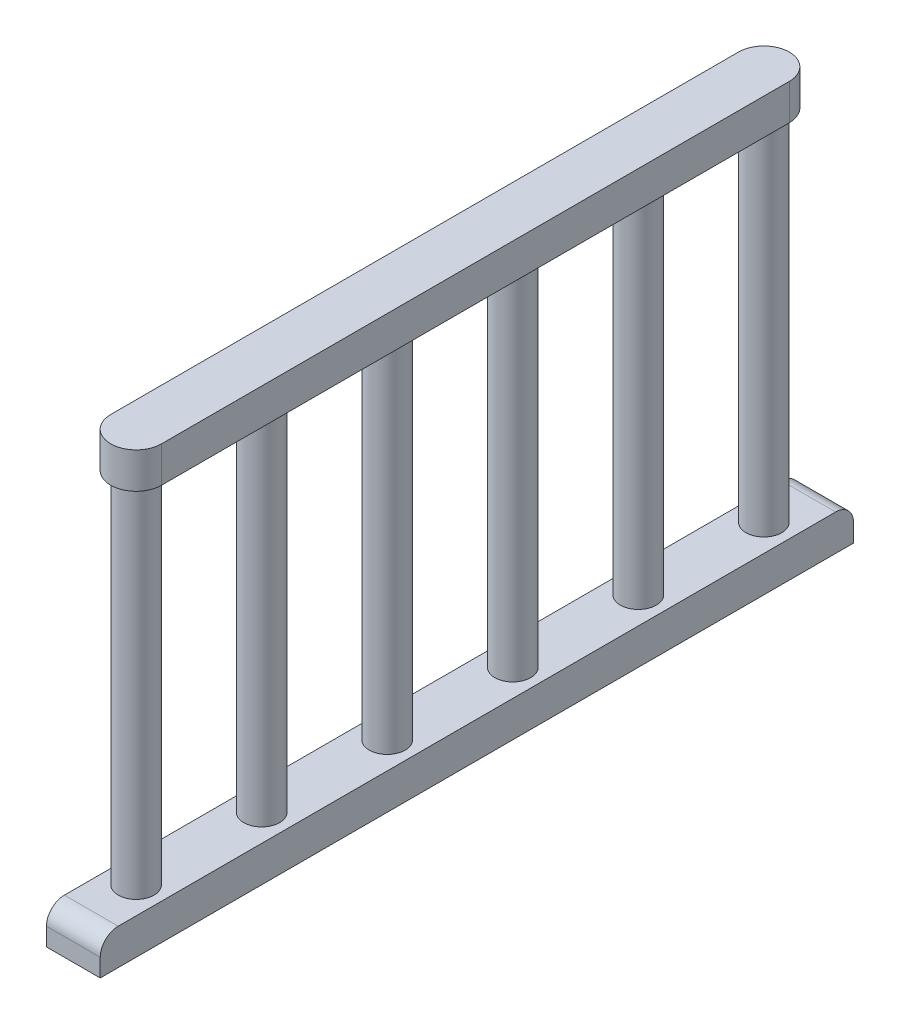
ISO-10303-21;
HEADER;
FILE_DESCRIPTION(('STEP AP214'),'2;1');
FILE_NAME('part.step','',(''),(''),'','','');
FILE_SCHEMA(('AUTOMOTIVE_DESIGN { 1 0 10303 214 1 1 1 1 }'));
ENDSEC;
DATA;
#1=APPLICATION_CONTEXT('core data for automotive mechanical design processes');
#2=APPLICATION_PROTOCOL_DEFINITION('international standard','automotive_design',2000,#1);
#3=PRODUCT_CONTEXT('',#1,'mechanical');
#4=PRODUCT('Part','Part','',(#3));
#5=PRODUCT_RELATED_PRODUCT_CATEGORY('part','',(#4));
#6=PRODUCT_DEFINITION_FORMATION('','',#4);
#7=PRODUCT_DEFINITION_CONTEXT('part definition',#1,'design');
#8=PRODUCT_DEFINITION('design','',#6,#7);
#9=PRODUCT_DEFINITION_SHAPE('','',#8);
#10=(LENGTH_UNIT() NAMED_UNIT(*) SI_UNIT(.MILLI.,.METRE.));
#11=(NAMED_UNIT(*) PLANE_ANGLE_UNIT() SI_UNIT($,.RADIAN.));
#12=(NAMED_UNIT(*) SI_UNIT($,.STERADIAN.) SOLID_ANGLE_UNIT());
#13=UNCERTAINTY_MEASURE_WITH_UNIT(LENGTH_MEASURE(1.E-05),#10,'distance_accuracy_value','');
#14=(GEOMETRIC_REPRESENTATION_CONTEXT(3) GLOBAL_UNCERTAINTY_ASSIGNED_CONTEXT((#13)) GLOBAL_UNIT_ASSIGNED_CONTEXT((#10,
#11,#12)) REPRESENTATION_CONTEXT('',''));
#15=CARTESIAN_POINT('',(0.,0.,0.));
#16=DIRECTION('',(0.,0.,1.));
#17=DIRECTION('',(1.,0.,0.));
#18=AXIS2_PLACEMENT_3D('',#15,#16,#17);
#19=CARTESIAN_POINT('',(1775.,1100.,-162.975951903808));
#20=DIRECTION('',(0.,-1.,0.));
#21=DIRECTION('',(0.,0.,-1.));
#22=AXIS2_PLACEMENT_3D('',#19,#20,#21);
#23=CYLINDRICAL_SURFACE('',#22,50.);
#24=CARTESIAN_POINT('',(1775.,1100.,-162.975951903808));
#25=DIRECTION('',(0.,1.,0.));
#26=DIRECTION('',(0.,0.,1.));
#27=AXIS2_PLACEMENT_3D('',#24,#25,#26);
#28=CIRCLE('',#27,50.);
#29=CARTESIAN_POINT('',(1775.,1100.,-112.975951903808));
#30=VERTEX_POINT('',#29);
#31=EDGE_CURVE('E244',#30,#30,#28,.T.);
#32=ORIENTED_EDGE('',*,*,#31,.F.);
#33=EDGE_LOOP('',(#32));
#34=FACE_BOUND('',#33,.T.);
#35=CARTESIAN_POINT('',(1775.,100.,-162.975951903808));
#36=DIRECTION('',(0.,1.,0.));
#37=DIRECTION('',(0.,0.,1.));
#38=AXIS2_PLACEMENT_3D('',#35,#36,#37);
#39=CIRCLE('',#38,50.);
#40=CARTESIAN_POINT('',(1775.,100.,-112.975951903808));
#41=VERTEX_POINT('',#40);
#42=EDGE_CURVE('E240',#41,#41,#39,.T.);
#43=ORIENTED_EDGE('',*,*,#42,.T.);
#44=EDGE_LOOP('',(#43));
#45=FACE_BOUND('',#44,.T.);
#46=ADVANCED_FACE('F45',(#34,#45),#23,.T.);
#47=CARTESIAN_POINT('',(1775.,1100.,-512.975951903808));
#48=DIRECTION('',(0.,-1.,0.));
#49=DIRECTION('',(0.,0.,-1.));
#50=AXIS2_PLACEMENT_3D('',#47,#48,#49);
#51=CYLINDRICAL_SURFACE('',#50,50.);
#52=CARTESIAN_POINT('',(1775.,1100.,-512.975951903808));
#53=DIRECTION('',(0.,1.,0.));
#54=DIRECTION('',(0.,0.,1.));
#55=AXIS2_PLACEMENT_3D('',#52,#53,#54);
#56=CIRCLE('',#55,50.);
#57=CARTESIAN_POINT('',(1775.,1100.,-462.975951903808));
#58=VERTEX_POINT('',#57);
#59=EDGE_CURVE('E236',#58,#58,#56,.T.);
#60=ORIENTED_EDGE('',*,*,#59,.F.);
#61=EDGE_LOOP('',(#60));
#62=FACE_BOUND('',#61,.T.);
#63=CARTESIAN_POINT('',(1775.,100.,-512.975951903808));
#64=DIRECTION('',(0.,1.,0.));
#65=DIRECTION('',(0.,0.,1.));
#66=AXIS2_PLACEMENT_3D('',#63,#64,#65);
#67=CIRCLE('',#66,50.);
#68=CARTESIAN_POINT('',(1775.,100.,-462.975951903808));
#69=VERTEX_POINT('',#68);
#70=EDGE_CURVE('E232',#69,#69,#67,.T.);
#71=ORIENTED_EDGE('',*,*,#70,.T.);
#72=EDGE_LOOP('',(#71));
#73=FACE_BOUND('',#72,.T.);
#74=ADVANCED_FACE('F295',(#62,#73),#51,.T.);
#75=CARTESIAN_POINT('',(1775.,1100.,-862.975951903808));
#76=DIRECTION('',(0.,-1.,0.));
#77=DIRECTION('',(0.,0.,-1.));
#78=AXIS2_PLACEMENT_3D('',#75,#76,#77);
#79=CYLINDRICAL_SURFACE('',#78,50.);
#80=CARTESIAN_POINT('',(1775.,1100.,-862.975951903808));
#81=DIRECTION('',(0.,1.,0.));
#82=DIRECTION('',(0.,0.,1.));
#83=AXIS2_PLACEMENT_3D('',#80,#81,#82);
#84=CIRCLE('',#83,50.);
#85=CARTESIAN_POINT('',(1775.,1100.,-812.975951903808));
#86=VERTEX_POINT('',#85);
#87=EDGE_CURVE('E228',#86,#86,#84,.T.);
#88=ORIENTED_EDGE('',*,*,#87,.F.);
#89=EDGE_LOOP('',(#88));
#90=FACE_BOUND('',#89,.T.);
#91=CARTESIAN_POINT('',(1775.,100.,-862.975951903808));
#92=DIRECTION('',(0.,1.,0.));
#93=DIRECTION('',(0.,0.,1.));
#94=AXIS2_PLACEMENT_3D('',#91,#92,#93);
#95=CIRCLE('',#94,50.);
#96=CARTESIAN_POINT('',(1775.,100.,-812.975951903808));
#97=VERTEX_POINT('',#96);
#98=EDGE_CURVE('E224',#97,#97,#95,.T.);
#99=ORIENTED_EDGE('',*,*,#98,.T.);
#100=EDGE_LOOP('',(#99));
#101=FACE_BOUND('',#100,.T.);
#102=ADVANCED_FACE('F302',(#90,#101),#79,.T.);
#103=CARTESIAN_POINT('',(1775.,1100.,-1212.97595190381));
#104=DIRECTION('',(0.,-1.,0.));
#105=DIRECTION('',(0.,0.,-1.));
#106=AXIS2_PLACEMENT_3D('',#103,#104,#105);
#107=CYLINDRICAL_SURFACE('',#106,50.);
#108=CARTESIAN_POINT('',(1775.,1100.,-1212.97595190381));
#109=DIRECTION('',(0.,1.,0.));
#110=DIRECTION('',(0.,0.,1.));
#111=AXIS2_PLACEMENT_3D('',#108,#109,#110);
#112=CIRCLE('',#111,50.);
#113=CARTESIAN_POINT('',(1775.,1100.,-1162.97595190381));
#114=VERTEX_POINT('',#113);
#115=EDGE_CURVE('E220',#114,#114,#112,.T.);
#116=ORIENTED_EDGE('',*,*,#115,.F.);
#117=EDGE_LOOP('',(#116));
#118=FACE_BOUND('',#117,.T.);
#119=CARTESIAN_POINT('',(1775.,100.,-1212.97595190381));
#120=DIRECTION('',(0.,1.,0.));
#121=DIRECTION('',(0.,0.,1.));
#122=AXIS2_PLACEMENT_3D('',#119,#120,#121);
#123=CIRCLE('',#122,50.);
#124=CARTESIAN_POINT('',(1775.,100.,-1162.97595190381));
#125=VERTEX_POINT('',#124);
#126=EDGE_CURVE('E216',#125,#125,#123,.T.);
#127=ORIENTED_EDGE('',*,*,#126,.T.);
#128=EDGE_LOOP('',(#127));
#129=FACE_BOUND('',#128,.T.);
#130=ADVANCED_FACE('F310',(#118,#129),#107,.T.);
#131=CARTESIAN_POINT('',(1850.,100.,12.0240480961924));
#132=DIRECTION('',(-1.,0.,0.));
#133=DIRECTION('',(0.,0.,1.));
#134=AXIS2_PLACEMENT_3D('',#131,#132,#133);
#135=PLANE('',#134);
#136=DIRECTION('',(0.,-1.,0.));
#137=VECTOR('',#136,1.);
#138=CARTESIAN_POINT('',(1850.,100.,-2087.97595190381));
#139=LINE('',#138,#137);
#140=CARTESIAN_POINT('',(1850.,50.,-2087.97595190381));
#141=VERTEX_POINT('',#140);
#142=CARTESIAN_POINT('',(1850.,0.,-2087.97595190381));
#143=VERTEX_POINT('',#142);
#144=EDGE_CURVE('E213',#141,#143,#139,.T.);
#145=ORIENTED_EDGE('',*,*,#144,.F.);
#146=CARTESIAN_POINT('',(1850.,50.,-2037.97595190381));
#147=DIRECTION('',(-1.,0.,0.));
#148=DIRECTION('',(0.,0.,1.));
#149=AXIS2_PLACEMENT_3D('',#146,#147,#148);
#150=CIRCLE('',#149,50.);
#151=CARTESIAN_POINT('',(1850.,100.,-2037.97595190381));
#152=VERTEX_POINT('',#151);
#153=EDGE_CURVE('E11',#141,#152,#150,.F.);
#154=ORIENTED_EDGE('',*,*,#153,.T.);
#155=DIRECTION('',(0.,0.,-1.));
#156=VECTOR('',#155,1.);
#157=CARTESIAN_POINT('',(1850.,100.,12.0240480961924));
#158=LINE('',#157,#156);
#159=CARTESIAN_POINT('',(1850.,100.,-37.9759519038076));
#160=VERTEX_POINT('',#159);
#161=EDGE_CURVE('E182',#160,#152,#158,.T.);
#162=ORIENTED_EDGE('',*,*,#161,.F.);
#163=CARTESIAN_POINT('',(1850.,50.,-37.9759519038076));
#164=DIRECTION('',(-1.,0.,0.));
#165=DIRECTION('',(0.,0.,1.));
#166=AXIS2_PLACEMENT_3D('',#163,#164,#165);
#167=CIRCLE('',#166,50.);
#168=CARTESIAN_POINT('',(1850.,50.,12.0240480961924));
#169=VERTEX_POINT('',#168);
#170=EDGE_CURVE('E252',#160,#169,#167,.F.);
#171=ORIENTED_EDGE('',*,*,#170,.T.);
#172=DIRECTION('',(0.,-1.,0.));
#173=VECTOR('',#172,1.);
#174=CARTESIAN_POINT('',(1850.,100.,12.0240480961924));
#175=LINE('',#174,#173);
#176=CARTESIAN_POINT('',(1850.,0.,12.0240480961924));
#177=VERTEX_POINT('',#176);
#178=EDGE_CURVE('E190',#169,#177,#175,.T.);
#179=ORIENTED_EDGE('',*,*,#178,.T.);
#180=DIRECTION('',(0.,0.,-1.));
#181=VECTOR('',#180,1.);
#182=CARTESIAN_POINT('',(1850.,0.,12.0240480961924));
#183=LINE('',#182,#181);
#184=EDGE_CURVE('E178',#177,#143,#183,.T.);
#185=ORIENTED_EDGE('',*,*,#184,.T.);
#186=EDGE_LOOP('',(#145,#154,#162,#171,#179,#185));
#187=FACE_BOUND('',#186,.T.);
#188=ADVANCED_FACE('F283',(#187),#135,.F.);
#189=CARTESIAN_POINT('',(1850.,100.,-2087.97595190381));
#190=DIRECTION('',(0.,0.,1.));
#191=DIRECTION('',(1.,0.,0.));
#192=AXIS2_PLACEMENT_3D('',#189,#190,#191);
#193=PLANE('',#192);
#194=DIRECTION('',(0.,-1.,0.));
#195=VECTOR('',#194,1.);
#196=CARTESIAN_POINT('',(1700.,100.,-2087.97595190381));
#197=LINE('',#196,#195);
#198=CARTESIAN_POINT('',(1700.,50.,-2087.97595190381));
#199=VERTEX_POINT('',#198);
#200=CARTESIAN_POINT('',(1700.,0.,-2087.97595190381));
#201=VERTEX_POINT('',#200);
#202=EDGE_CURVE('E210',#199,#201,#197,.T.);
#203=ORIENTED_EDGE('',*,*,#202,.F.);
#204=DIRECTION('',(-1.,0.,0.));
#205=VECTOR('',#204,1.);
#206=CARTESIAN_POINT('',(1850.,50.,-2087.97595190381));
#207=LINE('',#206,#205);
#208=EDGE_CURVE('E54',#199,#141,#207,.F.);
#209=ORIENTED_EDGE('',*,*,#208,.T.);
#210=ORIENTED_EDGE('',*,*,#144,.T.);
#211=DIRECTION('',(-1.,0.,0.));
#212=VECTOR('',#211,1.);
#213=CARTESIAN_POINT('',(1850.,0.,-2087.97595190381));
#214=LINE('',#213,#212);
#215=EDGE_CURVE('E194',#143,#201,#214,.T.);
#216=ORIENTED_EDGE('',*,*,#215,.T.);
#217=EDGE_LOOP('',(#203,#209,#210,#216));
#218=FACE_BOUND('',#217,.T.);
#219=ADVANCED_FACE('F317',(#218),#193,.F.);
#220=CARTESIAN_POINT('',(1700.,100.,12.0240480961924));
#221=DIRECTION('',(1.,0.,0.));
#222=DIRECTION('',(0.,0.,-1.));
#223=AXIS2_PLACEMENT_3D('',#220,#221,#222);
#224=PLANE('',#223);
#225=DIRECTION('',(0.,0.,1.));
#226=VECTOR('',#225,1.);
#227=CARTESIAN_POINT('',(1700.,100.,12.0240480961924));
#228=LINE('',#227,#226);
#229=CARTESIAN_POINT('',(1700.,100.,-2037.97595190381));
#230=VERTEX_POINT('',#229);
#231=CARTESIAN_POINT('',(1700.,100.,-37.9759519038076));
#232=VERTEX_POINT('',#231);
#233=EDGE_CURVE('E186',#230,#232,#228,.T.);
#234=ORIENTED_EDGE('',*,*,#233,.F.);
#235=CARTESIAN_POINT('',(1700.,50.,-2037.97595190381));
#236=DIRECTION('',(1.,0.,0.));
#237=DIRECTION('',(0.,0.,-1.));
#238=AXIS2_PLACEMENT_3D('',#235,#236,#237);
#239=CIRCLE('',#238,50.);
#240=EDGE_CURVE('E68',#230,#199,#239,.F.);
#241=ORIENTED_EDGE('',*,*,#240,.T.);
#242=ORIENTED_EDGE('',*,*,#202,.T.);
#243=DIRECTION('',(0.,0.,1.));
#244=VECTOR('',#243,1.);
#245=CARTESIAN_POINT('',(1700.,0.,12.0240480961924));
#246=LINE('',#245,#244);
#247=CARTESIAN_POINT('',(1700.,0.,12.0240480961924));
#248=VERTEX_POINT('',#247);
#249=EDGE_CURVE('E198',#201,#248,#246,.T.);
#250=ORIENTED_EDGE('',*,*,#249,.T.);
#251=DIRECTION('',(0.,-1.,0.));
#252=VECTOR('',#251,1.);
#253=CARTESIAN_POINT('',(1700.,100.,12.0240480961924));
#254=LINE('',#253,#252);
#255=CARTESIAN_POINT('',(1700.,50.,12.0240480961924));
#256=VERTEX_POINT('',#255);
#257=EDGE_CURVE('E207',#256,#248,#254,.T.);
#258=ORIENTED_EDGE('',*,*,#257,.F.);
#259=CARTESIAN_POINT('',(1700.,50.,-37.9759519038076));
#260=DIRECTION('',(1.,0.,0.));
#261=DIRECTION('',(0.,0.,-1.));
#262=AXIS2_PLACEMENT_3D('',#259,#260,#261);
#263=CIRCLE('',#262,50.);
#264=EDGE_CURVE('E258',#256,#232,#263,.F.);
#265=ORIENTED_EDGE('',*,*,#264,.T.);
#266=EDGE_LOOP('',(#234,#241,#242,#250,#258,#265));
#267=FACE_BOUND('',#266,.T.);
#268=ADVANCED_FACE('F275',(#267),#224,.F.);
#269=CARTESIAN_POINT('',(1850.,100.,12.0240480961924));
#270=DIRECTION('',(0.,0.,-1.));
#271=DIRECTION('',(-1.,0.,0.));
#272=AXIS2_PLACEMENT_3D('',#269,#270,#271);
#273=PLANE('',#272);
#274=ORIENTED_EDGE('',*,*,#178,.F.);
#275=DIRECTION('',(1.,0.,0.));
#276=VECTOR('',#275,1.);
#277=CARTESIAN_POINT('',(1700.,50.,12.0240480961924));
#278=LINE('',#277,#276);
#279=EDGE_CURVE('E255',#169,#256,#278,.F.);
#280=ORIENTED_EDGE('',*,*,#279,.T.);
#281=ORIENTED_EDGE('',*,*,#257,.T.);
#282=DIRECTION('',(1.,0.,0.));
#283=VECTOR('',#282,1.);
#284=CARTESIAN_POINT('',(1850.,0.,12.0240480961924));
#285=LINE('',#284,#283);
#286=EDGE_CURVE('E187',#248,#177,#285,.T.);
#287=ORIENTED_EDGE('',*,*,#286,.T.);
#288=EDGE_LOOP('',(#274,#280,#281,#287));
#289=FACE_BOUND('',#288,.T.);
#290=ADVANCED_FACE('F322',(#289),#273,.F.);
#291=CARTESIAN_POINT('',(0.,100.,0.));
#292=DIRECTION('',(0.,1.,0.));
#293=DIRECTION('',(0.,0.,1.));
#294=AXIS2_PLACEMENT_3D('',#291,#292,#293);
#295=PLANE('',#294);
#296=CARTESIAN_POINT('',(1775.,100.,-1562.97595190381));
#297=DIRECTION('',(0.,1.,0.));
#298=DIRECTION('',(0.,0.,1.));
#299=AXIS2_PLACEMENT_3D('',#296,#297,#298);
#300=CIRCLE('',#299,50.);
#301=CARTESIAN_POINT('',(1775.,100.,-1512.97595190381));
#302=VERTEX_POINT('',#301);
#303=EDGE_CURVE('E150',#302,#302,#300,.T.);
#304=ORIENTED_EDGE('',*,*,#303,.F.);
#305=EDGE_LOOP('',(#304));
#306=FACE_BOUND('',#305,.T.);
#307=CARTESIAN_POINT('',(1775.,100.,-1912.97595190381));
#308=DIRECTION('',(0.,1.,0.));
#309=DIRECTION('',(0.,0.,1.));
#310=AXIS2_PLACEMENT_3D('',#307,#308,#309);
#311=CIRCLE('',#310,50.);
#312=CARTESIAN_POINT('',(1775.,100.,-1862.97595190381));
#313=VERTEX_POINT('',#312);
#314=EDGE_CURVE('E173',#313,#313,#311,.T.);
#315=ORIENTED_EDGE('',*,*,#314,.F.);
#316=EDGE_LOOP('',(#315));
#317=FACE_BOUND('',#316,.T.);
#318=ORIENTED_EDGE('',*,*,#161,.T.);
#319=DIRECTION('',(-1.,0.,0.));
#320=VECTOR('',#319,1.);
#321=CARTESIAN_POINT('',(1700.,100.,-2037.97595190381));
#322=LINE('',#321,#320);
#323=EDGE_CURVE('E262',#152,#230,#322,.T.);
#324=ORIENTED_EDGE('',*,*,#323,.T.);
#325=ORIENTED_EDGE('',*,*,#233,.T.);
#326=DIRECTION('',(1.,0.,0.));
#327=VECTOR('',#326,1.);
#328=CARTESIAN_POINT('',(1850.,100.,-37.9759519038076));
#329=LINE('',#328,#327);
#330=EDGE_CURVE('E248',#232,#160,#329,.T.);
#331=ORIENTED_EDGE('',*,*,#330,.T.);
#332=EDGE_LOOP('',(#318,#324,#325,#331));
#333=FACE_BOUND('',#332,.T.);
#334=ORIENTED_EDGE('',*,*,#126,.F.);
#335=EDGE_LOOP('',(#334));
#336=FACE_BOUND('',#335,.T.);
#337=ORIENTED_EDGE('',*,*,#98,.F.);
#338=EDGE_LOOP('',(#337));
#339=FACE_BOUND('',#338,.T.);
#340=ORIENTED_EDGE('',*,*,#70,.F.);
#341=EDGE_LOOP('',(#340));
#342=FACE_BOUND('',#341,.T.);
#343=ORIENTED_EDGE('',*,*,#42,.F.);
#344=EDGE_LOOP('',(#343));
#345=FACE_BOUND('',#344,.T.);
#346=ADVANCED_FACE('F270',(#306,#317,#333,#336,#339,#342,#345),#295,.T.);
#347=CARTESIAN_POINT('',(0.,0.,0.));
#348=DIRECTION('',(0.,1.,0.));
#349=DIRECTION('',(0.,0.,1.));
#350=AXIS2_PLACEMENT_3D('',#347,#348,#349);
#351=PLANE('',#350);
#352=ORIENTED_EDGE('',*,*,#184,.F.);
#353=ORIENTED_EDGE('',*,*,#286,.F.);
#354=ORIENTED_EDGE('',*,*,#249,.F.);
#355=ORIENTED_EDGE('',*,*,#215,.F.);
#356=EDGE_LOOP('',(#352,#353,#354,#355));
#357=FACE_BOUND('',#356,.T.);
#358=ADVANCED_FACE('F326',(#357),#351,.F.);
#359=CARTESIAN_POINT('',(1775.,1100.,-1912.97595190381));
#360=DIRECTION('',(0.,-1.,0.));
#361=DIRECTION('',(0.,0.,-1.));
#362=AXIS2_PLACEMENT_3D('',#359,#360,#361);
#363=CYLINDRICAL_SURFACE('',#362,50.);
#364=CARTESIAN_POINT('',(1775.,1100.,-1912.97595190381));
#365=DIRECTION('',(0.,1.,0.));
#366=DIRECTION('',(0.,0.,1.));
#367=AXIS2_PLACEMENT_3D('',#364,#365,#366);
#368=CIRCLE('',#367,50.);
#369=CARTESIAN_POINT('',(1775.,1100.,-1862.97595190381));
#370=VERTEX_POINT('',#369);
#371=EDGE_CURVE('E174',#370,#370,#368,.T.);
#372=ORIENTED_EDGE('',*,*,#371,.F.);
#373=EDGE_LOOP('',(#372));
#374=FACE_BOUND('',#373,.T.);
#375=ORIENTED_EDGE('',*,*,#314,.T.);
#376=EDGE_LOOP('',(#375));
#377=FACE_BOUND('',#376,.T.);
#378=ADVANCED_FACE('F329',(#374,#377),#363,.T.);
#379=CARTESIAN_POINT('',(1775.,1100.,-1562.97595190381));
#380=DIRECTION('',(0.,-1.,0.));
#381=DIRECTION('',(0.,0.,-1.));
#382=AXIS2_PLACEMENT_3D('',#379,#380,#381);
#383=CYLINDRICAL_SURFACE('',#382,50.);
#384=CARTESIAN_POINT('',(1775.,1100.,-1562.97595190381));
#385=DIRECTION('',(0.,1.,0.));
#386=DIRECTION('',(0.,0.,1.));
#387=AXIS2_PLACEMENT_3D('',#384,#385,#386);
#388=CIRCLE('',#387,50.);
#389=CARTESIAN_POINT('',(1775.,1100.,-1512.97595190381));
#390=VERTEX_POINT('',#389);
#391=EDGE_CURVE('E155',#390,#390,#388,.T.);
#392=ORIENTED_EDGE('',*,*,#391,.F.);
#393=EDGE_LOOP('',(#392));
#394=FACE_BOUND('',#393,.T.);
#395=ORIENTED_EDGE('',*,*,#303,.T.);
#396=EDGE_LOOP('',(#395));
#397=FACE_BOUND('',#396,.T.);
#398=ADVANCED_FACE('F293',(#394,#397),#383,.T.);
#399=CARTESIAN_POINT('',(0.,50.,-37.9759519038076));
#400=DIRECTION('',(-1.,0.,0.));
#401=DIRECTION('',(0.,0.,1.));
#402=AXIS2_PLACEMENT_3D('',#399,#400,#401);
#403=CYLINDRICAL_SURFACE('',#402,50.);
#404=ORIENTED_EDGE('',*,*,#264,.F.);
#405=ORIENTED_EDGE('',*,*,#279,.F.);
#406=ORIENTED_EDGE('',*,*,#170,.F.);
#407=ORIENTED_EDGE('',*,*,#330,.F.);
#408=EDGE_LOOP('',(#404,#405,#406,#407));
#409=FACE_BOUND('',#408,.T.);
#410=ADVANCED_FACE('F281',(#409),#403,.T.);
#411=CARTESIAN_POINT('',(0.,50.,-2037.97595190381));
#412=DIRECTION('',(1.,0.,0.));
#413=DIRECTION('',(0.,0.,-1.));
#414=AXIS2_PLACEMENT_3D('',#411,#412,#413);
#415=CYLINDRICAL_SURFACE('',#414,50.);
#416=ORIENTED_EDGE('',*,*,#153,.F.);
#417=ORIENTED_EDGE('',*,*,#208,.F.);
#418=ORIENTED_EDGE('',*,*,#240,.F.);
#419=ORIENTED_EDGE('',*,*,#323,.F.);
#420=EDGE_LOOP('',(#416,#417,#418,#419));
#421=FACE_BOUND('',#420,.T.);
#422=ADVANCED_FACE('F47',(#421),#415,.T.);
#423=CARTESIAN_POINT('',(1775.,1200.,-162.975951903808));
#424=DIRECTION('',(0.,-1.,0.));
#425=DIRECTION('',(0.,0.,-1.));
#426=AXIS2_PLACEMENT_3D('',#423,#424,#425);
#427=CYLINDRICAL_SURFACE('',#426,70.8383393209071);
#428=CARTESIAN_POINT('',(1775.,1100.,-162.975951903808));
#429=DIRECTION('',(0.,1.,0.));
#430=DIRECTION('',(0.,0.,-1.));
#431=AXIS2_PLACEMENT_3D('',#428,#429,#430);
#432=CIRCLE('',#431,70.8383393209071);
#433=CARTESIAN_POINT('',(1704.16166067909,1100.,-162.975951903808));
#434=VERTEX_POINT('',#433);
#435=CARTESIAN_POINT('',(1845.83833932091,1100.,-162.975951903808));
#436=VERTEX_POINT('',#435);
#437=EDGE_CURVE('E141',#434,#436,#432,.T.);
#438=ORIENTED_EDGE('',*,*,#437,.T.);
#439=DIRECTION('',(0.,-1.,0.));
#440=VECTOR('',#439,1.);
#441=CARTESIAN_POINT('',(1845.83833932091,1200.,-162.975951903808));
#442=LINE('',#441,#440);
#443=CARTESIAN_POINT('',(1845.83833932091,1200.,-162.975951903808));
#444=VERTEX_POINT('',#443);
#445=EDGE_CURVE('E359',#444,#436,#442,.T.);
#446=ORIENTED_EDGE('',*,*,#445,.F.);
#447=CARTESIAN_POINT('',(1775.,1200.,-162.975951903808));
#448=DIRECTION('',(0.,1.,0.));
#449=DIRECTION('',(0.,0.,-1.));
#450=AXIS2_PLACEMENT_3D('',#447,#448,#449);
#451=CIRCLE('',#450,70.8383393209071);
#452=CARTESIAN_POINT('',(1704.16166067909,1200.,-162.975951903808));
#453=VERTEX_POINT('',#452);
#454=EDGE_CURVE('E135',#453,#444,#451,.T.);
#455=ORIENTED_EDGE('',*,*,#454,.F.);
#456=DIRECTION('',(0.,-1.,0.));
#457=VECTOR('',#456,1.);
#458=CARTESIAN_POINT('',(1704.16166067909,1200.,-162.975951903808));
#459=LINE('',#458,#457);
#460=EDGE_CURVE('E126',#453,#434,#459,.T.);
#461=ORIENTED_EDGE('',*,*,#460,.T.);
#462=EDGE_LOOP('',(#438,#446,#455,#461));
#463=FACE_BOUND('',#462,.T.);
#464=ADVANCED_FACE('F139',(#463),#427,.T.);
#465=CARTESIAN_POINT('',(1845.83833932091,1200.,-162.975951903808));
#466=DIRECTION('',(-1.,0.,0.));
#467=DIRECTION('',(0.,0.,1.));
#468=AXIS2_PLACEMENT_3D('',#465,#466,#467);
#469=PLANE('',#468);
#470=DIRECTION('',(0.,0.,-1.));
#471=VECTOR('',#470,1.);
#472=CARTESIAN_POINT('',(1845.83833932091,1100.,-162.975951903808));
#473=LINE('',#472,#471);
#474=CARTESIAN_POINT('',(1845.83833932091,1100.,-1912.97595190381));
#475=VERTEX_POINT('',#474);
#476=EDGE_CURVE('E147',#436,#475,#473,.T.);
#477=ORIENTED_EDGE('',*,*,#476,.T.);
#478=DIRECTION('',(0.,-1.,0.));
#479=VECTOR('',#478,1.);
#480=CARTESIAN_POINT('',(1845.83833932091,1200.,-1912.97595190381));
#481=LINE('',#480,#479);
#482=CARTESIAN_POINT('',(1845.83833932091,1200.,-1912.97595190381));
#483=VERTEX_POINT('',#482);
#484=EDGE_CURVE('E357',#483,#475,#481,.T.);
#485=ORIENTED_EDGE('',*,*,#484,.F.);
#486=DIRECTION('',(0.,0.,-1.));
#487=VECTOR('',#486,1.);
#488=CARTESIAN_POINT('',(1845.83833932091,1200.,-162.975951903808));
#489=LINE('',#488,#487);
#490=EDGE_CURVE('E165',#444,#483,#489,.T.);
#491=ORIENTED_EDGE('',*,*,#490,.F.);
#492=ORIENTED_EDGE('',*,*,#445,.T.);
#493=EDGE_LOOP('',(#477,#485,#491,#492));
#494=FACE_BOUND('',#493,.T.);
#495=ADVANCED_FACE('F290',(#494),#469,.F.);
#496=CARTESIAN_POINT('',(1775.,1200.,-1912.97595190381));
#497=DIRECTION('',(0.,-1.,0.));
#498=DIRECTION('',(0.,0.,-1.));
#499=AXIS2_PLACEMENT_3D('',#496,#497,#498);
#500=CYLINDRICAL_SURFACE('',#499,70.8383393209071);
#501=CARTESIAN_POINT('',(1775.,1100.,-1912.97595190381));
#502=DIRECTION('',(0.,1.,0.));
#503=DIRECTION('',(0.,0.,-1.));
#504=AXIS2_PLACEMENT_3D('',#501,#502,#503);
#505=CIRCLE('',#504,70.8383393209071);
#506=CARTESIAN_POINT('',(1704.16166067909,1100.,-1912.97595190381));
#507=VERTEX_POINT('',#506);
#508=EDGE_CURVE('E134',#475,#507,#505,.T.);
#509=ORIENTED_EDGE('',*,*,#508,.T.);
#510=DIRECTION('',(0.,-1.,0.));
#511=VECTOR('',#510,1.);
#512=CARTESIAN_POINT('',(1704.16166067909,1200.,-1912.97595190381));
#513=LINE('',#512,#511);
#514=CARTESIAN_POINT('',(1704.16166067909,1200.,-1912.97595190381));
#515=VERTEX_POINT('',#514);
#516=EDGE_CURVE('E129',#515,#507,#513,.T.);
#517=ORIENTED_EDGE('',*,*,#516,.F.);
#518=CARTESIAN_POINT('',(1775.,1200.,-1912.97595190381));
#519=DIRECTION('',(0.,1.,0.));
#520=DIRECTION('',(0.,0.,-1.));
#521=AXIS2_PLACEMENT_3D('',#518,#519,#520);
#522=CIRCLE('',#521,70.8383393209071);
#523=EDGE_CURVE('E162',#483,#515,#522,.T.);
#524=ORIENTED_EDGE('',*,*,#523,.F.);
#525=ORIENTED_EDGE('',*,*,#484,.T.);
#526=EDGE_LOOP('',(#509,#517,#524,#525));
#527=FACE_BOUND('',#526,.T.);
#528=ADVANCED_FACE('F347',(#527),#500,.T.);
#529=CARTESIAN_POINT('',(1704.16166067909,1200.,-162.975951903808));
#530=DIRECTION('',(1.,0.,0.));
#531=DIRECTION('',(0.,0.,-1.));
#532=AXIS2_PLACEMENT_3D('',#529,#530,#531);
#533=PLANE('',#532);
#534=DIRECTION('',(0.,0.,1.));
#535=VECTOR('',#534,1.);
#536=CARTESIAN_POINT('',(1704.16166067909,1100.,-162.975951903808));
#537=LINE('',#536,#535);
#538=EDGE_CURVE('E122',#507,#434,#537,.T.);
#539=ORIENTED_EDGE('',*,*,#538,.T.);
#540=ORIENTED_EDGE('',*,*,#460,.F.);
#541=DIRECTION('',(0.,0.,1.));
#542=VECTOR('',#541,1.);
#543=CARTESIAN_POINT('',(1704.16166067909,1200.,-162.975951903808));
#544=LINE('',#543,#542);
#545=EDGE_CURVE('E144',#515,#453,#544,.T.);
#546=ORIENTED_EDGE('',*,*,#545,.F.);
#547=ORIENTED_EDGE('',*,*,#516,.T.);
#548=EDGE_LOOP('',(#539,#540,#546,#547));
#549=FACE_BOUND('',#548,.T.);
#550=ADVANCED_FACE('F124',(#549),#533,.F.);
#551=CARTESIAN_POINT('',(1775.,1200.,-162.975951903808));
#552=DIRECTION('',(0.,-1.,0.));
#553=DIRECTION('',(0.,0.,-1.));
#554=AXIS2_PLACEMENT_3D('',#551,#552,#553);
#555=PLANE('',#554);
#556=ORIENTED_EDGE('',*,*,#454,.T.);
#557=ORIENTED_EDGE('',*,*,#490,.T.);
#558=ORIENTED_EDGE('',*,*,#523,.T.);
#559=ORIENTED_EDGE('',*,*,#545,.T.);
#560=EDGE_LOOP('',(#556,#557,#558,#559));
#561=FACE_BOUND('',#560,.T.);
#562=ADVANCED_FACE('F338',(#561),#555,.F.);
#563=CARTESIAN_POINT('',(1775.,1100.,-162.975951903808));
#564=DIRECTION('',(0.,-1.,0.));
#565=DIRECTION('',(0.,0.,-1.));
#566=AXIS2_PLACEMENT_3D('',#563,#564,#565);
#567=PLANE('',#566);
#568=ORIENTED_EDGE('',*,*,#31,.T.);
#569=EDGE_LOOP('',(#568));
#570=FACE_BOUND('',#569,.T.);
#571=ORIENTED_EDGE('',*,*,#59,.T.);
#572=EDGE_LOOP('',(#571));
#573=FACE_BOUND('',#572,.T.);
#574=ORIENTED_EDGE('',*,*,#87,.T.);
#575=EDGE_LOOP('',(#574));
#576=FACE_BOUND('',#575,.T.);
#577=ORIENTED_EDGE('',*,*,#115,.T.);
#578=EDGE_LOOP('',(#577));
#579=FACE_BOUND('',#578,.T.);
#580=ORIENTED_EDGE('',*,*,#371,.T.);
#581=EDGE_LOOP('',(#580));
#582=FACE_BOUND('',#581,.T.);
#583=ORIENTED_EDGE('',*,*,#391,.T.);
#584=EDGE_LOOP('',(#583));
#585=FACE_BOUND('',#584,.T.);
#586=ORIENTED_EDGE('',*,*,#437,.F.);
#587=ORIENTED_EDGE('',*,*,#538,.F.);
#588=ORIENTED_EDGE('',*,*,#508,.F.);
#589=ORIENTED_EDGE('',*,*,#476,.F.);
#590=EDGE_LOOP('',(#586,#587,#588,#589));
#591=FACE_BOUND('',#590,.T.);
#592=ADVANCED_FACE('F146',(#570,#573,#576,#579,#582,#585,#591),#567,.T.);
#593=CLOSED_SHELL('',(#46,#74,#102,#130,#188,#219,#268,#290,#346,#358,#378,#398,#410,#422,#464,
#495,#528,#550,#562,#592));
#594=MANIFOLD_SOLID_BREP('B2',#593);
#595=ADVANCED_BREP_SHAPE_REPRESENTATION('',(#18,#594),#14);
#596=SHAPE_DEFINITION_REPRESENTATION(#9,#595);
ENDSEC;
END-ISO-10303-21;
